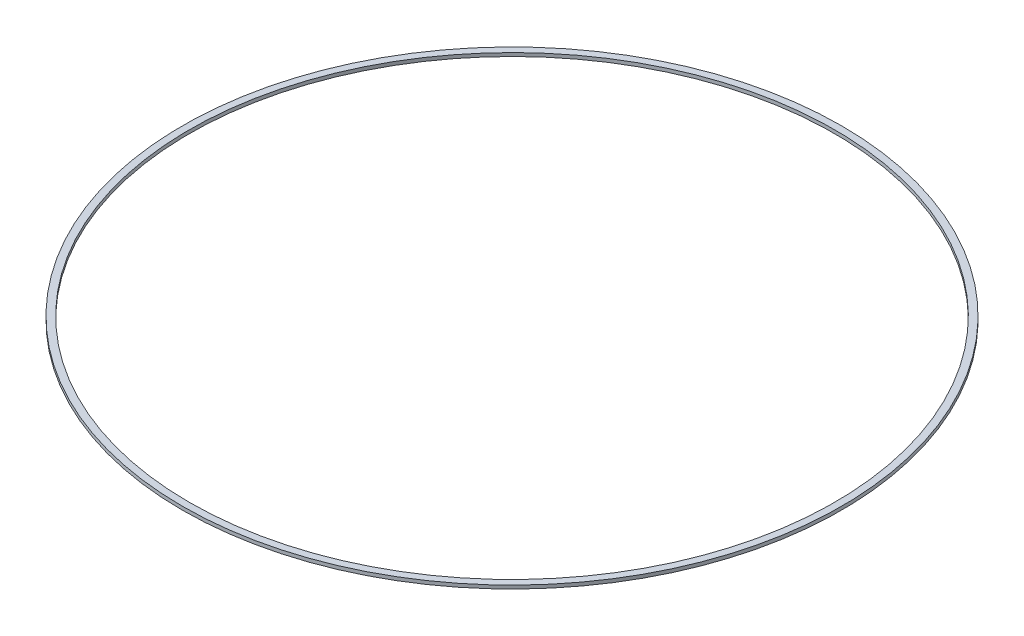
ISO-10303-21;
HEADER;
FILE_DESCRIPTION(('STEP AP214'),'2;1');
FILE_NAME('part.step','',(''),(''),'','','');
FILE_SCHEMA(('AUTOMOTIVE_DESIGN { 1 0 10303 214 1 1 1 1 }'));
ENDSEC;
DATA;
#1=APPLICATION_CONTEXT('core data for automotive mechanical design processes');
#2=APPLICATION_PROTOCOL_DEFINITION('international standard','automotive_design',2000,#1);
#3=PRODUCT_CONTEXT('',#1,'mechanical');
#4=PRODUCT('Part','Part','',(#3));
#5=PRODUCT_RELATED_PRODUCT_CATEGORY('part','',(#4));
#6=PRODUCT_DEFINITION_FORMATION('','',#4);
#7=PRODUCT_DEFINITION_CONTEXT('part definition',#1,'design');
#8=PRODUCT_DEFINITION('design','',#6,#7);
#9=PRODUCT_DEFINITION_SHAPE('','',#8);
#10=(LENGTH_UNIT() NAMED_UNIT(*) SI_UNIT(.MILLI.,.METRE.));
#11=(NAMED_UNIT(*) PLANE_ANGLE_UNIT() SI_UNIT($,.RADIAN.));
#12=(NAMED_UNIT(*) SI_UNIT($,.STERADIAN.) SOLID_ANGLE_UNIT());
#13=UNCERTAINTY_MEASURE_WITH_UNIT(LENGTH_MEASURE(1.E-05),#10,'distance_accuracy_value','');
#14=(GEOMETRIC_REPRESENTATION_CONTEXT(3) GLOBAL_UNCERTAINTY_ASSIGNED_CONTEXT((#13)) GLOBAL_UNIT_ASSIGNED_CONTEXT((#10,
#11,#12)) REPRESENTATION_CONTEXT('',''));
#15=CARTESIAN_POINT('',(0.,0.,0.));
#16=DIRECTION('',(0.,0.,1.));
#17=DIRECTION('',(1.,0.,0.));
#18=AXIS2_PLACEMENT_3D('',#15,#16,#17);
#19=CARTESIAN_POINT('',(-3.22156926473473,2.,-4.6022418067639));
#20=DIRECTION('',(0.,-1.,0.));
#21=DIRECTION('',(0.,0.,-1.));
#22=AXIS2_PLACEMENT_3D('',#19,#20,#21);
#23=CYLINDRICAL_SURFACE('',#22,192.);
#24=CARTESIAN_POINT('',(-3.22156926473473,2.,-4.6022418067639));
#25=DIRECTION('',(0.,1.,0.));
#26=DIRECTION('',(0.,0.,1.));
#27=AXIS2_PLACEMENT_3D('',#24,#25,#26);
#28=CIRCLE('',#27,192.);
#29=CARTESIAN_POINT('',(-3.22156926473473,2.,187.397758193236));
#30=VERTEX_POINT('',#29);
#31=EDGE_CURVE('E38',#30,#30,#28,.T.);
#32=ORIENTED_EDGE('',*,*,#31,.F.);
#33=EDGE_LOOP('',(#32));
#34=FACE_BOUND('',#33,.T.);
#35=CARTESIAN_POINT('',(-3.22156926473473,0.,-4.6022418067639));
#36=DIRECTION('',(0.,1.,0.));
#37=DIRECTION('',(0.,0.,1.));
#38=AXIS2_PLACEMENT_3D('',#35,#36,#37);
#39=CIRCLE('',#38,192.);
#40=CARTESIAN_POINT('',(-3.22156926473473,0.,187.397758193236));
#41=VERTEX_POINT('',#40);
#42=EDGE_CURVE('E44',#41,#41,#39,.T.);
#43=ORIENTED_EDGE('',*,*,#42,.T.);
#44=EDGE_LOOP('',(#43));
#45=FACE_BOUND('',#44,.T.);
#46=ADVANCED_FACE('F31',(#34,#45),#23,.T.);
#47=CARTESIAN_POINT('',(-3.22156926473473,2.,-4.6022418067639));
#48=DIRECTION('',(0.,-1.,0.));
#49=DIRECTION('',(0.,0.,-1.));
#50=AXIS2_PLACEMENT_3D('',#47,#48,#49);
#51=CYLINDRICAL_SURFACE('',#50,188.);
#52=CARTESIAN_POINT('',(-3.22156926473473,2.,-4.6022418067639));
#53=DIRECTION('',(0.,1.,0.));
#54=DIRECTION('',(0.,0.,1.));
#55=AXIS2_PLACEMENT_3D('',#52,#53,#54);
#56=CIRCLE('',#55,188.);
#57=CARTESIAN_POINT('',(-3.22156926473473,2.,183.397758193236));
#58=VERTEX_POINT('',#57);
#59=EDGE_CURVE('E10',#58,#58,#56,.T.);
#60=ORIENTED_EDGE('',*,*,#59,.T.);
#61=EDGE_LOOP('',(#60));
#62=FACE_BOUND('',#61,.T.);
#63=CARTESIAN_POINT('',(-3.22156926473473,0.,-4.6022418067639));
#64=DIRECTION('',(0.,1.,0.));
#65=DIRECTION('',(0.,0.,1.));
#66=AXIS2_PLACEMENT_3D('',#63,#64,#65);
#67=CIRCLE('',#66,188.);
#68=CARTESIAN_POINT('',(-3.22156926473473,0.,183.397758193236));
#69=VERTEX_POINT('',#68);
#70=EDGE_CURVE('E34',#69,#69,#67,.T.);
#71=ORIENTED_EDGE('',*,*,#70,.F.);
#72=EDGE_LOOP('',(#71));
#73=FACE_BOUND('',#72,.T.);
#74=ADVANCED_FACE('F53',(#62,#73),#51,.F.);
#75=CARTESIAN_POINT('',(0.,2.,0.));
#76=DIRECTION('',(0.,1.,0.));
#77=DIRECTION('',(0.,0.,1.));
#78=AXIS2_PLACEMENT_3D('',#75,#76,#77);
#79=PLANE('',#78);
#80=ORIENTED_EDGE('',*,*,#31,.T.);
#81=EDGE_LOOP('',(#80));
#82=FACE_BOUND('',#81,.T.);
#83=ORIENTED_EDGE('',*,*,#59,.F.);
#84=EDGE_LOOP('',(#83));
#85=FACE_BOUND('',#84,.T.);
#86=ADVANCED_FACE('F55',(#82,#85),#79,.T.);
#87=CARTESIAN_POINT('',(0.,0.,0.));
#88=DIRECTION('',(0.,1.,0.));
#89=DIRECTION('',(0.,0.,1.));
#90=AXIS2_PLACEMENT_3D('',#87,#88,#89);
#91=PLANE('',#90);
#92=ORIENTED_EDGE('',*,*,#42,.F.);
#93=EDGE_LOOP('',(#92));
#94=FACE_BOUND('',#93,.T.);
#95=ORIENTED_EDGE('',*,*,#70,.T.);
#96=EDGE_LOOP('',(#95));
#97=FACE_BOUND('',#96,.T.);
#98=ADVANCED_FACE('F51',(#94,#97),#91,.F.);
#99=CLOSED_SHELL('',(#46,#74,#86,#98));
#100=MANIFOLD_SOLID_BREP('B2',#99);
#101=ADVANCED_BREP_SHAPE_REPRESENTATION('',(#18,#100),#14);
#102=SHAPE_DEFINITION_REPRESENTATION(#9,#101);
ENDSEC;
END-ISO-10303-21;
